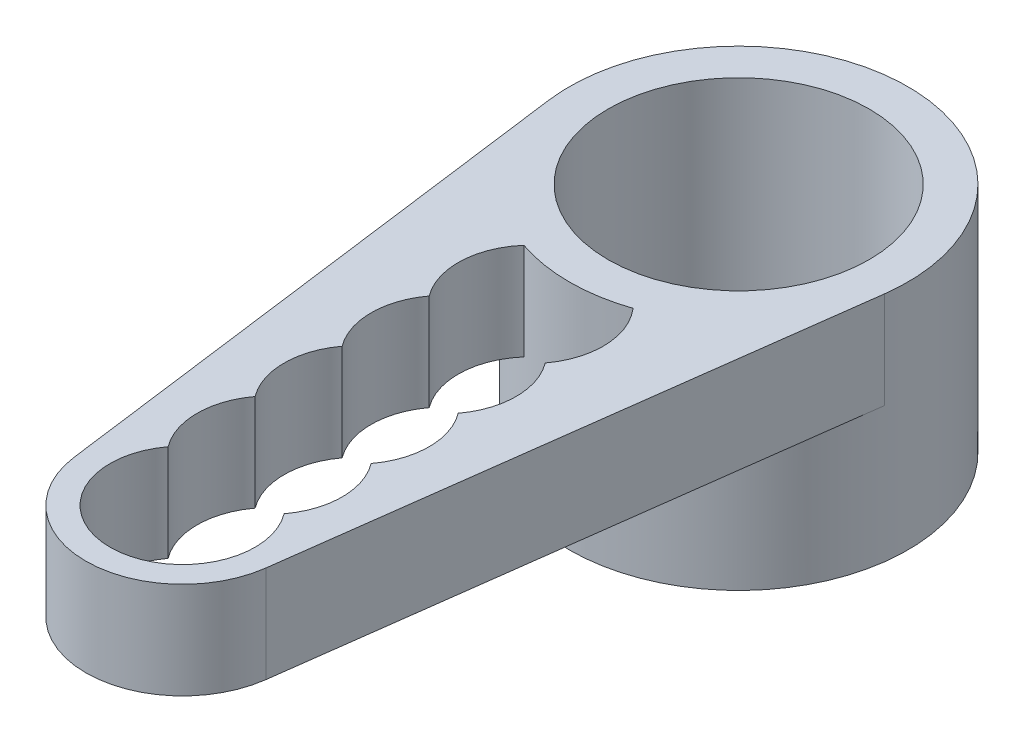
ISO-10303-21;
HEADER;
FILE_DESCRIPTION(('STEP AP214'),'2;1');
FILE_NAME('part.step','',(''),(''),'','','');
FILE_SCHEMA(('AUTOMOTIVE_DESIGN { 1 0 10303 214 1 1 1 1 }'));
ENDSEC;
DATA;
#1=APPLICATION_CONTEXT('core data for automotive mechanical design processes');
#2=APPLICATION_PROTOCOL_DEFINITION('international standard','automotive_design',2000,#1);
#3=PRODUCT_CONTEXT('',#1,'mechanical');
#4=PRODUCT('Part','Part','',(#3));
#5=PRODUCT_RELATED_PRODUCT_CATEGORY('part','',(#4));
#6=PRODUCT_DEFINITION_FORMATION('','',#4);
#7=PRODUCT_DEFINITION_CONTEXT('part definition',#1,'design');
#8=PRODUCT_DEFINITION('design','',#6,#7);
#9=PRODUCT_DEFINITION_SHAPE('','',#8);
#10=(LENGTH_UNIT() NAMED_UNIT(*) SI_UNIT(.MILLI.,.METRE.));
#11=(NAMED_UNIT(*) PLANE_ANGLE_UNIT() SI_UNIT($,.RADIAN.));
#12=(NAMED_UNIT(*) SI_UNIT($,.STERADIAN.) SOLID_ANGLE_UNIT());
#13=UNCERTAINTY_MEASURE_WITH_UNIT(LENGTH_MEASURE(1.E-05),#10,'distance_accuracy_value','');
#14=(GEOMETRIC_REPRESENTATION_CONTEXT(3) GLOBAL_UNCERTAINTY_ASSIGNED_CONTEXT((#13)) GLOBAL_UNIT_ASSIGNED_CONTEXT((#10,
#11,#12)) REPRESENTATION_CONTEXT('',''));
#15=CARTESIAN_POINT('',(0.,0.,0.));
#16=DIRECTION('',(0.,0.,1.));
#17=DIRECTION('',(1.,0.,0.));
#18=AXIS2_PLACEMENT_3D('',#15,#16,#17);
#19=CARTESIAN_POINT('',(0.,4.8,0.));
#20=DIRECTION('',(0.,-1.,0.));
#21=DIRECTION('',(0.,0.,-1.));
#22=AXIS2_PLACEMENT_3D('',#19,#20,#21);
#23=CYLINDRICAL_SURFACE('',#22,3.5);
#24=CARTESIAN_POINT('',(0.,0.,0.));
#25=DIRECTION('',(0.,1.,0.));
#26=DIRECTION('',(0.,0.,1.));
#27=AXIS2_PLACEMENT_3D('',#24,#25,#26);
#28=CIRCLE('',#27,3.5);
#29=CARTESIAN_POINT('',(0.,0.,3.5));
#30=VERTEX_POINT('',#29);
#31=EDGE_CURVE('E40',#30,#30,#28,.T.);
#32=ORIENTED_EDGE('',*,*,#31,.T.);
#33=EDGE_LOOP('',(#32));
#34=FACE_BOUND('',#33,.T.);
#35=DIRECTION('',(0.,1.,0.));
#36=VECTOR('',#35,1.);
#37=CARTESIAN_POINT('',(1.12934396593854,2.8,3.31279069767443));
#38=LINE('',#37,#36);
#39=CARTESIAN_POINT('',(1.12934396593854,2.8,3.31279069767443));
#40=VERTEX_POINT('',#39);
#41=CARTESIAN_POINT('',(1.12934396593854,4.8,3.31279069767443));
#42=VERTEX_POINT('',#41);
#43=EDGE_CURVE('E164',#40,#42,#38,.T.);
#44=ORIENTED_EDGE('',*,*,#43,.T.);
#45=CARTESIAN_POINT('',(0.,4.8,0.));
#46=DIRECTION('',(0.,1.,0.));
#47=DIRECTION('',(0.,0.,1.));
#48=AXIS2_PLACEMENT_3D('',#45,#46,#47);
#49=CIRCLE('',#48,3.5);
#50=CARTESIAN_POINT('',(-1.12934396593858,4.8,3.31279069767441));
#51=VERTEX_POINT('',#50);
#52=EDGE_CURVE('E45',#51,#42,#49,.T.);
#53=ORIENTED_EDGE('',*,*,#52,.F.);
#54=DIRECTION('',(0.,1.,0.));
#55=VECTOR('',#54,1.);
#56=CARTESIAN_POINT('',(-1.12934396593858,2.8,3.31279069767441));
#57=LINE('',#56,#55);
#58=CARTESIAN_POINT('',(-1.12934396593858,2.8,3.31279069767441));
#59=VERTEX_POINT('',#58);
#60=EDGE_CURVE('E220',#59,#51,#57,.T.);
#61=ORIENTED_EDGE('',*,*,#60,.F.);
#62=CARTESIAN_POINT('',(0.,2.8,0.));
#63=DIRECTION('',(0.,1.,0.));
#64=DIRECTION('',(0.,0.,1.));
#65=AXIS2_PLACEMENT_3D('',#62,#63,#64);
#66=CIRCLE('',#65,3.5);
#67=CARTESIAN_POINT('',(-3.47009911986694,2.8,0.456521739130435));
#68=VERTEX_POINT('',#67);
#69=EDGE_CURVE('E170',#68,#59,#66,.T.);
#70=ORIENTED_EDGE('',*,*,#69,.F.);
#71=DIRECTION('',(0.,1.,0.));
#72=VECTOR('',#71,1.);
#73=CARTESIAN_POINT('',(-3.47009911986694,2.8,0.456521739130435));
#74=LINE('',#73,#72);
#75=CARTESIAN_POINT('',(-3.47009911986694,4.8,0.456521739130435));
#76=VERTEX_POINT('',#75);
#77=EDGE_CURVE('E217',#68,#76,#74,.T.);
#78=ORIENTED_EDGE('',*,*,#77,.T.);
#79=CARTESIAN_POINT('',(3.47009911986694,4.8,0.456521739130433));
#80=VERTEX_POINT('',#79);
#81=EDGE_CURVE('E11',#80,#76,#49,.T.);
#82=ORIENTED_EDGE('',*,*,#81,.F.);
#83=DIRECTION('',(0.,1.,0.));
#84=VECTOR('',#83,1.);
#85=CARTESIAN_POINT('',(3.47009911986694,2.8,0.456521739130433));
#86=LINE('',#85,#84);
#87=CARTESIAN_POINT('',(3.47009911986694,2.8,0.456521739130433));
#88=VERTEX_POINT('',#87);
#89=EDGE_CURVE('E211',#88,#80,#86,.T.);
#90=ORIENTED_EDGE('',*,*,#89,.F.);
#91=EDGE_CURVE('E160',#40,#88,#66,.T.);
#92=ORIENTED_EDGE('',*,*,#91,.F.);
#93=EDGE_LOOP('',(#44,#53,#61,#70,#78,#82,#90,#92));
#94=FACE_BOUND('',#93,.T.);
#95=ADVANCED_FACE('F37',(#34,#94),#23,.T.);
#96=CARTESIAN_POINT('',(0.,4.8,0.));
#97=DIRECTION('',(0.,1.,0.));
#98=DIRECTION('',(0.,0.,1.));
#99=AXIS2_PLACEMENT_3D('',#96,#97,#98);
#100=PLANE('',#99);
#101=DIRECTION('',(0.130434782608695,0.,-0.991456891390555));
#102=VECTOR('',#101,1.);
#103=CARTESIAN_POINT('',(3.47009911986694,4.8,0.456521739130433));
#104=LINE('',#103,#102);
#105=CARTESIAN_POINT('',(1.98291378278112,4.8,11.7608695652174));
#106=VERTEX_POINT('',#105);
#107=EDGE_CURVE('E59',#106,#80,#104,.T.);
#108=ORIENTED_EDGE('',*,*,#107,.T.);
#109=ORIENTED_EDGE('',*,*,#81,.T.);
#110=DIRECTION('',(0.130434782608696,0.,0.991456891390555));
#111=VECTOR('',#110,1.);
#112=CARTESIAN_POINT('',(-3.47009911986694,4.8,0.456521739130435));
#113=LINE('',#112,#111);
#114=CARTESIAN_POINT('',(-1.98291378278111,4.8,11.7608695652174));
#115=VERTEX_POINT('',#114);
#116=EDGE_CURVE('E205',#76,#115,#113,.T.);
#117=ORIENTED_EDGE('',*,*,#116,.T.);
#118=CARTESIAN_POINT('',(0.,4.8,11.5));
#119=DIRECTION('',(0.,1.,0.));
#120=DIRECTION('',(0.,0.,1.));
#121=AXIS2_PLACEMENT_3D('',#118,#119,#120);
#122=CIRCLE('',#121,2.);
#123=EDGE_CURVE('E168',#115,#106,#122,.T.);
#124=ORIENTED_EDGE('',*,*,#123,.T.);
#125=EDGE_LOOP('',(#108,#109,#117,#124));
#126=FACE_BOUND('',#125,.T.);
#127=ORIENTED_EDGE('',*,*,#52,.T.);
#128=CARTESIAN_POINT('',(0.,4.8,4.3));
#129=DIRECTION('',(0.,1.,0.));
#130=DIRECTION('',(0.,0.,1.));
#131=AXIS2_PLACEMENT_3D('',#128,#129,#130);
#132=CIRCLE('',#131,1.5);
#133=CARTESIAN_POINT('',(1.19999999999998,4.8,5.2));
#134=VERTEX_POINT('',#133);
#135=EDGE_CURVE('E193',#134,#42,#132,.T.);
#136=ORIENTED_EDGE('',*,*,#135,.F.);
#137=CARTESIAN_POINT('',(0.,4.8,6.1));
#138=DIRECTION('',(0.,1.,0.));
#139=DIRECTION('',(0.,0.,1.));
#140=AXIS2_PLACEMENT_3D('',#137,#138,#139);
#141=CIRCLE('',#140,1.5);
#142=CARTESIAN_POINT('',(1.19999999999999,4.8,7.));
#143=VERTEX_POINT('',#142);
#144=EDGE_CURVE('E156',#143,#134,#141,.T.);
#145=ORIENTED_EDGE('',*,*,#144,.F.);
#146=CARTESIAN_POINT('',(0.,4.8,7.9));
#147=DIRECTION('',(0.,1.,0.));
#148=DIRECTION('',(0.,0.,1.));
#149=AXIS2_PLACEMENT_3D('',#146,#147,#148);
#150=CIRCLE('',#149,1.5);
#151=CARTESIAN_POINT('',(1.19999999999999,4.8,8.8));
#152=VERTEX_POINT('',#151);
#153=EDGE_CURVE('E196',#152,#143,#150,.T.);
#154=ORIENTED_EDGE('',*,*,#153,.F.);
#155=CARTESIAN_POINT('',(0.,4.8,9.7));
#156=DIRECTION('',(0.,1.,0.));
#157=DIRECTION('',(0.,0.,1.));
#158=AXIS2_PLACEMENT_3D('',#155,#156,#157);
#159=CIRCLE('',#158,1.5);
#160=CARTESIAN_POINT('',(1.2,4.8,10.6));
#161=VERTEX_POINT('',#160);
#162=EDGE_CURVE('E199',#161,#152,#159,.T.);
#163=ORIENTED_EDGE('',*,*,#162,.F.);
#164=CARTESIAN_POINT('',(0.,4.8,11.5));
#165=DIRECTION('',(0.,1.,0.));
#166=DIRECTION('',(0.,0.,1.));
#167=AXIS2_PLACEMENT_3D('',#164,#165,#166);
#168=CIRCLE('',#167,1.5);
#169=CARTESIAN_POINT('',(-1.2,4.8,10.6));
#170=VERTEX_POINT('',#169);
#171=EDGE_CURVE('E202',#170,#161,#168,.T.);
#172=ORIENTED_EDGE('',*,*,#171,.F.);
#173=CARTESIAN_POINT('',(-1.20000000000001,4.8,8.80000000000001));
#174=VERTEX_POINT('',#173);
#175=EDGE_CURVE('E203',#174,#170,#159,.T.);
#176=ORIENTED_EDGE('',*,*,#175,.F.);
#177=CARTESIAN_POINT('',(-1.20000000000001,4.8,7.00000000000001));
#178=VERTEX_POINT('',#177);
#179=EDGE_CURVE('E200',#178,#174,#150,.T.);
#180=ORIENTED_EDGE('',*,*,#179,.F.);
#181=CARTESIAN_POINT('',(-1.20000000000002,4.8,5.20000000000001));
#182=VERTEX_POINT('',#181);
#183=EDGE_CURVE('E197',#182,#178,#141,.T.);
#184=ORIENTED_EDGE('',*,*,#183,.F.);
#185=EDGE_CURVE('E52',#51,#182,#132,.T.);
#186=ORIENTED_EDGE('',*,*,#185,.F.);
#187=EDGE_LOOP('',(#127,#136,#145,#154,#163,#172,#176,#180,#184,#186));
#188=FACE_BOUND('',#187,.T.);
#189=CARTESIAN_POINT('',(0.,4.8,0.));
#190=DIRECTION('',(0.,1.,0.));
#191=DIRECTION('',(0.,0.,1.));
#192=AXIS2_PLACEMENT_3D('',#189,#190,#191);
#193=CIRCLE('',#192,2.7);
#194=CARTESIAN_POINT('',(0.,4.8,2.7));
#195=VERTEX_POINT('',#194);
#196=EDGE_CURVE('E241',#195,#195,#193,.T.);
#197=ORIENTED_EDGE('',*,*,#196,.F.);
#198=EDGE_LOOP('',(#197));
#199=FACE_BOUND('',#198,.T.);
#200=ADVANCED_FACE('F255',(#126,#188,#199),#100,.T.);
#201=CARTESIAN_POINT('',(0.,0.,0.));
#202=DIRECTION('',(0.,1.,0.));
#203=DIRECTION('',(0.,0.,1.));
#204=AXIS2_PLACEMENT_3D('',#201,#202,#203);
#205=PLANE('',#204);
#206=ORIENTED_EDGE('',*,*,#31,.F.);
#207=EDGE_LOOP('',(#206));
#208=FACE_BOUND('',#207,.T.);
#209=CARTESIAN_POINT('',(0.,0.,0.));
#210=DIRECTION('',(0.,1.,0.));
#211=DIRECTION('',(0.,0.,1.));
#212=AXIS2_PLACEMENT_3D('',#209,#210,#211);
#213=CIRCLE('',#212,2.7);
#214=CARTESIAN_POINT('',(0.,0.,2.7));
#215=VERTEX_POINT('',#214);
#216=EDGE_CURVE('E210',#215,#215,#213,.T.);
#217=ORIENTED_EDGE('',*,*,#216,.T.);
#218=EDGE_LOOP('',(#217));
#219=FACE_BOUND('',#218,.T.);
#220=ADVANCED_FACE('F251',(#208,#219),#205,.F.);
#221=CARTESIAN_POINT('',(0.,4.8,0.));
#222=DIRECTION('',(0.,-1.,0.));
#223=DIRECTION('',(0.,0.,-1.));
#224=AXIS2_PLACEMENT_3D('',#221,#222,#223);
#225=CYLINDRICAL_SURFACE('',#224,2.7);
#226=ORIENTED_EDGE('',*,*,#196,.T.);
#227=EDGE_LOOP('',(#226));
#228=FACE_BOUND('',#227,.T.);
#229=ORIENTED_EDGE('',*,*,#216,.F.);
#230=EDGE_LOOP('',(#229));
#231=FACE_BOUND('',#230,.T.);
#232=ADVANCED_FACE('F254',(#228,#231),#225,.F.);
#233=CARTESIAN_POINT('',(0.,2.8,4.3));
#234=DIRECTION('',(0.,1.,0.));
#235=DIRECTION('',(0.,0.,1.));
#236=AXIS2_PLACEMENT_3D('',#233,#234,#235);
#237=CYLINDRICAL_SURFACE('',#236,1.5);
#238=ORIENTED_EDGE('',*,*,#135,.T.);
#239=ORIENTED_EDGE('',*,*,#43,.F.);
#240=CARTESIAN_POINT('',(0.,2.8,4.3));
#241=DIRECTION('',(0.,1.,0.));
#242=DIRECTION('',(0.,0.,1.));
#243=AXIS2_PLACEMENT_3D('',#240,#241,#242);
#244=CIRCLE('',#243,1.5);
#245=CARTESIAN_POINT('',(1.19999999999998,2.8,5.2));
#246=VERTEX_POINT('',#245);
#247=EDGE_CURVE('E143',#246,#40,#244,.T.);
#248=ORIENTED_EDGE('',*,*,#247,.F.);
#249=DIRECTION('',(0.,1.,0.));
#250=VECTOR('',#249,1.);
#251=CARTESIAN_POINT('',(1.19999999999998,2.8,5.2));
#252=LINE('',#251,#250);
#253=EDGE_CURVE('E153',#246,#134,#252,.T.);
#254=ORIENTED_EDGE('',*,*,#253,.T.);
#255=EDGE_LOOP('',(#238,#239,#248,#254));
#256=FACE_BOUND('',#255,.T.);
#257=ADVANCED_FACE('F162',(#256),#237,.F.);
#258=CARTESIAN_POINT('',(3.47009911986694,2.8,0.456521739130433));
#259=DIRECTION('',(0.991456891390555,0.,0.130434782608695));
#260=DIRECTION('',(0.130434782608695,0.,-0.991456891390555));
#261=AXIS2_PLACEMENT_3D('',#258,#259,#260);
#262=PLANE('',#261);
#263=ORIENTED_EDGE('',*,*,#107,.F.);
#264=DIRECTION('',(0.,1.,0.));
#265=VECTOR('',#264,1.);
#266=CARTESIAN_POINT('',(1.98291378278112,2.8,11.7608695652174));
#267=LINE('',#266,#265);
#268=CARTESIAN_POINT('',(1.98291378278112,2.8,11.7608695652174));
#269=VERTEX_POINT('',#268);
#270=EDGE_CURVE('E213',#269,#106,#267,.T.);
#271=ORIENTED_EDGE('',*,*,#270,.F.);
#272=DIRECTION('',(0.130434782608695,0.,-0.991456891390555));
#273=VECTOR('',#272,1.);
#274=CARTESIAN_POINT('',(3.47009911986694,2.8,0.456521739130433));
#275=LINE('',#274,#273);
#276=EDGE_CURVE('E190',#269,#88,#275,.T.);
#277=ORIENTED_EDGE('',*,*,#276,.T.);
#278=ORIENTED_EDGE('',*,*,#89,.T.);
#279=EDGE_LOOP('',(#263,#271,#277,#278));
#280=FACE_BOUND('',#279,.T.);
#281=ADVANCED_FACE('F264',(#280),#262,.T.);
#282=CARTESIAN_POINT('',(0.,2.8,11.5));
#283=DIRECTION('',(0.,1.,0.));
#284=DIRECTION('',(0.,0.,1.));
#285=AXIS2_PLACEMENT_3D('',#282,#283,#284);
#286=CYLINDRICAL_SURFACE('',#285,2.);
#287=ORIENTED_EDGE('',*,*,#123,.F.);
#288=DIRECTION('',(0.,1.,0.));
#289=VECTOR('',#288,1.);
#290=CARTESIAN_POINT('',(-1.98291378278111,2.8,11.7608695652174));
#291=LINE('',#290,#289);
#292=CARTESIAN_POINT('',(-1.98291378278111,2.8,11.7608695652174));
#293=VERTEX_POINT('',#292);
#294=EDGE_CURVE('E215',#293,#115,#291,.T.);
#295=ORIENTED_EDGE('',*,*,#294,.F.);
#296=CARTESIAN_POINT('',(0.,2.8,11.5));
#297=DIRECTION('',(0.,1.,0.));
#298=DIRECTION('',(0.,0.,1.));
#299=AXIS2_PLACEMENT_3D('',#296,#297,#298);
#300=CIRCLE('',#299,2.);
#301=EDGE_CURVE('E187',#293,#269,#300,.T.);
#302=ORIENTED_EDGE('',*,*,#301,.T.);
#303=ORIENTED_EDGE('',*,*,#270,.T.);
#304=EDGE_LOOP('',(#287,#295,#302,#303));
#305=FACE_BOUND('',#304,.T.);
#306=ADVANCED_FACE('F309',(#305),#286,.T.);
#307=CARTESIAN_POINT('',(-3.47009911986694,2.8,0.456521739130435));
#308=DIRECTION('',(-0.991456891390555,0.,0.130434782608696));
#309=DIRECTION('',(0.130434782608696,0.,0.991456891390555));
#310=AXIS2_PLACEMENT_3D('',#307,#308,#309);
#311=PLANE('',#310);
#312=ORIENTED_EDGE('',*,*,#116,.F.);
#313=ORIENTED_EDGE('',*,*,#77,.F.);
#314=DIRECTION('',(0.130434782608696,0.,0.991456891390555));
#315=VECTOR('',#314,1.);
#316=CARTESIAN_POINT('',(-3.47009911986694,2.8,0.456521739130435));
#317=LINE('',#316,#315);
#318=EDGE_CURVE('E173',#68,#293,#317,.T.);
#319=ORIENTED_EDGE('',*,*,#318,.T.);
#320=ORIENTED_EDGE('',*,*,#294,.T.);
#321=EDGE_LOOP('',(#312,#313,#319,#320));
#322=FACE_BOUND('',#321,.T.);
#323=ADVANCED_FACE('F318',(#322),#311,.T.);
#324=ORIENTED_EDGE('',*,*,#185,.T.);
#325=DIRECTION('',(0.,1.,0.));
#326=VECTOR('',#325,1.);
#327=CARTESIAN_POINT('',(-1.20000000000002,2.8,5.20000000000001));
#328=LINE('',#327,#326);
#329=CARTESIAN_POINT('',(-1.20000000000002,2.8,5.20000000000001));
#330=VERTEX_POINT('',#329);
#331=EDGE_CURVE('E222',#330,#182,#328,.T.);
#332=ORIENTED_EDGE('',*,*,#331,.F.);
#333=EDGE_CURVE('E167',#59,#330,#244,.T.);
#334=ORIENTED_EDGE('',*,*,#333,.F.);
#335=ORIENTED_EDGE('',*,*,#60,.T.);
#336=EDGE_LOOP('',(#324,#332,#334,#335));
#337=FACE_BOUND('',#336,.T.);
#338=ADVANCED_FACE('F266',(#337),#237,.F.);
#339=CARTESIAN_POINT('',(0.,2.8,6.1));
#340=DIRECTION('',(0.,1.,0.));
#341=DIRECTION('',(0.,0.,1.));
#342=AXIS2_PLACEMENT_3D('',#339,#340,#341);
#343=CYLINDRICAL_SURFACE('',#342,1.5);
#344=ORIENTED_EDGE('',*,*,#183,.T.);
#345=DIRECTION('',(0.,1.,0.));
#346=VECTOR('',#345,1.);
#347=CARTESIAN_POINT('',(-1.20000000000001,2.8,7.00000000000001));
#348=LINE('',#347,#346);
#349=CARTESIAN_POINT('',(-1.20000000000001,2.8,7.00000000000001));
#350=VERTEX_POINT('',#349);
#351=EDGE_CURVE('E225',#350,#178,#348,.T.);
#352=ORIENTED_EDGE('',*,*,#351,.F.);
#353=CARTESIAN_POINT('',(0.,2.8,6.1));
#354=DIRECTION('',(0.,1.,0.));
#355=DIRECTION('',(0.,0.,1.));
#356=AXIS2_PLACEMENT_3D('',#353,#354,#355);
#357=CIRCLE('',#356,1.5);
#358=EDGE_CURVE('E151',#330,#350,#357,.T.);
#359=ORIENTED_EDGE('',*,*,#358,.F.);
#360=ORIENTED_EDGE('',*,*,#331,.T.);
#361=EDGE_LOOP('',(#344,#352,#359,#360));
#362=FACE_BOUND('',#361,.T.);
#363=ADVANCED_FACE('F335',(#362),#343,.F.);
#364=CARTESIAN_POINT('',(0.,2.8,7.9));
#365=DIRECTION('',(0.,1.,0.));
#366=DIRECTION('',(0.,0.,1.));
#367=AXIS2_PLACEMENT_3D('',#364,#365,#366);
#368=CYLINDRICAL_SURFACE('',#367,1.5);
#369=ORIENTED_EDGE('',*,*,#179,.T.);
#370=DIRECTION('',(0.,1.,0.));
#371=VECTOR('',#370,1.);
#372=CARTESIAN_POINT('',(-1.20000000000001,2.8,8.80000000000001));
#373=LINE('',#372,#371);
#374=CARTESIAN_POINT('',(-1.20000000000001,2.8,8.80000000000001));
#375=VERTEX_POINT('',#374);
#376=EDGE_CURVE('E228',#375,#174,#373,.T.);
#377=ORIENTED_EDGE('',*,*,#376,.F.);
#378=CARTESIAN_POINT('',(0.,2.8,7.9));
#379=DIRECTION('',(0.,1.,0.));
#380=DIRECTION('',(0.,0.,1.));
#381=AXIS2_PLACEMENT_3D('',#378,#379,#380);
#382=CIRCLE('',#381,1.5);
#383=EDGE_CURVE('E175',#350,#375,#382,.T.);
#384=ORIENTED_EDGE('',*,*,#383,.F.);
#385=ORIENTED_EDGE('',*,*,#351,.T.);
#386=EDGE_LOOP('',(#369,#377,#384,#385));
#387=FACE_BOUND('',#386,.T.);
#388=ADVANCED_FACE('F343',(#387),#368,.F.);
#389=CARTESIAN_POINT('',(0.,2.8,9.7));
#390=DIRECTION('',(0.,1.,0.));
#391=DIRECTION('',(0.,0.,1.));
#392=AXIS2_PLACEMENT_3D('',#389,#390,#391);
#393=CYLINDRICAL_SURFACE('',#392,1.5);
#394=ORIENTED_EDGE('',*,*,#175,.T.);
#395=DIRECTION('',(0.,1.,0.));
#396=VECTOR('',#395,1.);
#397=CARTESIAN_POINT('',(-1.2,2.8,10.6));
#398=LINE('',#397,#396);
#399=CARTESIAN_POINT('',(-1.2,2.8,10.6));
#400=VERTEX_POINT('',#399);
#401=EDGE_CURVE('E231',#400,#170,#398,.T.);
#402=ORIENTED_EDGE('',*,*,#401,.F.);
#403=CARTESIAN_POINT('',(0.,2.8,9.7));
#404=DIRECTION('',(0.,1.,0.));
#405=DIRECTION('',(0.,0.,1.));
#406=AXIS2_PLACEMENT_3D('',#403,#404,#405);
#407=CIRCLE('',#406,1.5);
#408=EDGE_CURVE('E178',#375,#400,#407,.T.);
#409=ORIENTED_EDGE('',*,*,#408,.F.);
#410=ORIENTED_EDGE('',*,*,#376,.T.);
#411=EDGE_LOOP('',(#394,#402,#409,#410));
#412=FACE_BOUND('',#411,.T.);
#413=ADVANCED_FACE('F352',(#412),#393,.F.);
#414=CARTESIAN_POINT('',(0.,2.8,11.5));
#415=DIRECTION('',(0.,1.,0.));
#416=DIRECTION('',(0.,0.,1.));
#417=AXIS2_PLACEMENT_3D('',#414,#415,#416);
#418=CYLINDRICAL_SURFACE('',#417,1.5);
#419=ORIENTED_EDGE('',*,*,#171,.T.);
#420=DIRECTION('',(0.,1.,0.));
#421=VECTOR('',#420,1.);
#422=CARTESIAN_POINT('',(1.2,2.8,10.6));
#423=LINE('',#422,#421);
#424=CARTESIAN_POINT('',(1.2,2.8,10.6));
#425=VERTEX_POINT('',#424);
#426=EDGE_CURVE('E234',#425,#161,#423,.T.);
#427=ORIENTED_EDGE('',*,*,#426,.F.);
#428=CARTESIAN_POINT('',(0.,2.8,11.5));
#429=DIRECTION('',(0.,1.,0.));
#430=DIRECTION('',(0.,0.,1.));
#431=AXIS2_PLACEMENT_3D('',#428,#429,#430);
#432=CIRCLE('',#431,1.5);
#433=EDGE_CURVE('E183',#400,#425,#432,.T.);
#434=ORIENTED_EDGE('',*,*,#433,.F.);
#435=ORIENTED_EDGE('',*,*,#401,.T.);
#436=EDGE_LOOP('',(#419,#427,#434,#435));
#437=FACE_BOUND('',#436,.T.);
#438=ADVANCED_FACE('F362',(#437),#418,.F.);
#439=ORIENTED_EDGE('',*,*,#162,.T.);
#440=DIRECTION('',(0.,1.,0.));
#441=VECTOR('',#440,1.);
#442=CARTESIAN_POINT('',(1.19999999999999,2.8,8.8));
#443=LINE('',#442,#441);
#444=CARTESIAN_POINT('',(1.19999999999999,2.8,8.8));
#445=VERTEX_POINT('',#444);
#446=EDGE_CURVE('E237',#445,#152,#443,.T.);
#447=ORIENTED_EDGE('',*,*,#446,.F.);
#448=EDGE_CURVE('E181',#425,#445,#407,.T.);
#449=ORIENTED_EDGE('',*,*,#448,.F.);
#450=ORIENTED_EDGE('',*,*,#426,.T.);
#451=EDGE_LOOP('',(#439,#447,#449,#450));
#452=FACE_BOUND('',#451,.T.);
#453=ADVANCED_FACE('F365',(#452),#393,.F.);
#454=ORIENTED_EDGE('',*,*,#153,.T.);
#455=DIRECTION('',(0.,1.,0.));
#456=VECTOR('',#455,1.);
#457=CARTESIAN_POINT('',(1.19999999999999,2.8,7.));
#458=LINE('',#457,#456);
#459=CARTESIAN_POINT('',(1.19999999999999,2.8,7.));
#460=VERTEX_POINT('',#459);
#461=EDGE_CURVE('E159',#460,#143,#458,.T.);
#462=ORIENTED_EDGE('',*,*,#461,.F.);
#463=EDGE_CURVE('E146',#445,#460,#382,.T.);
#464=ORIENTED_EDGE('',*,*,#463,.F.);
#465=ORIENTED_EDGE('',*,*,#446,.T.);
#466=EDGE_LOOP('',(#454,#462,#464,#465));
#467=FACE_BOUND('',#466,.T.);
#468=ADVANCED_FACE('F355',(#467),#368,.F.);
#469=ORIENTED_EDGE('',*,*,#144,.T.);
#470=ORIENTED_EDGE('',*,*,#253,.F.);
#471=EDGE_CURVE('E139',#460,#246,#357,.T.);
#472=ORIENTED_EDGE('',*,*,#471,.F.);
#473=ORIENTED_EDGE('',*,*,#461,.T.);
#474=EDGE_LOOP('',(#469,#470,#472,#473));
#475=FACE_BOUND('',#474,.T.);
#476=ADVANCED_FACE('F154',(#475),#343,.F.);
#477=CARTESIAN_POINT('',(0.,2.8,0.));
#478=DIRECTION('',(0.,1.,0.));
#479=DIRECTION('',(0.,0.,1.));
#480=AXIS2_PLACEMENT_3D('',#477,#478,#479);
#481=PLANE('',#480);
#482=ORIENTED_EDGE('',*,*,#247,.T.);
#483=ORIENTED_EDGE('',*,*,#91,.T.);
#484=ORIENTED_EDGE('',*,*,#276,.F.);
#485=ORIENTED_EDGE('',*,*,#301,.F.);
#486=ORIENTED_EDGE('',*,*,#318,.F.);
#487=ORIENTED_EDGE('',*,*,#69,.T.);
#488=ORIENTED_EDGE('',*,*,#333,.T.);
#489=ORIENTED_EDGE('',*,*,#358,.T.);
#490=ORIENTED_EDGE('',*,*,#383,.T.);
#491=ORIENTED_EDGE('',*,*,#408,.T.);
#492=ORIENTED_EDGE('',*,*,#433,.T.);
#493=ORIENTED_EDGE('',*,*,#448,.T.);
#494=ORIENTED_EDGE('',*,*,#463,.T.);
#495=ORIENTED_EDGE('',*,*,#471,.T.);
#496=EDGE_LOOP('',(#482,#483,#484,#485,#486,#487,#488,#489,#490,#491,#492,#493,#494,#495));
#497=FACE_BOUND('',#496,.T.);
#498=ADVANCED_FACE('F141',(#497),#481,.F.);
#499=CLOSED_SHELL('',(#95,#200,#220,#232,#257,#281,#306,#323,#338,#363,#388,#413,#438,#453,#468,
#476,#498));
#500=MANIFOLD_SOLID_BREP('B2',#499);
#501=ADVANCED_BREP_SHAPE_REPRESENTATION('',(#18,#500),#14);
#502=SHAPE_DEFINITION_REPRESENTATION(#9,#501);
ENDSEC;
END-ISO-10303-21;
